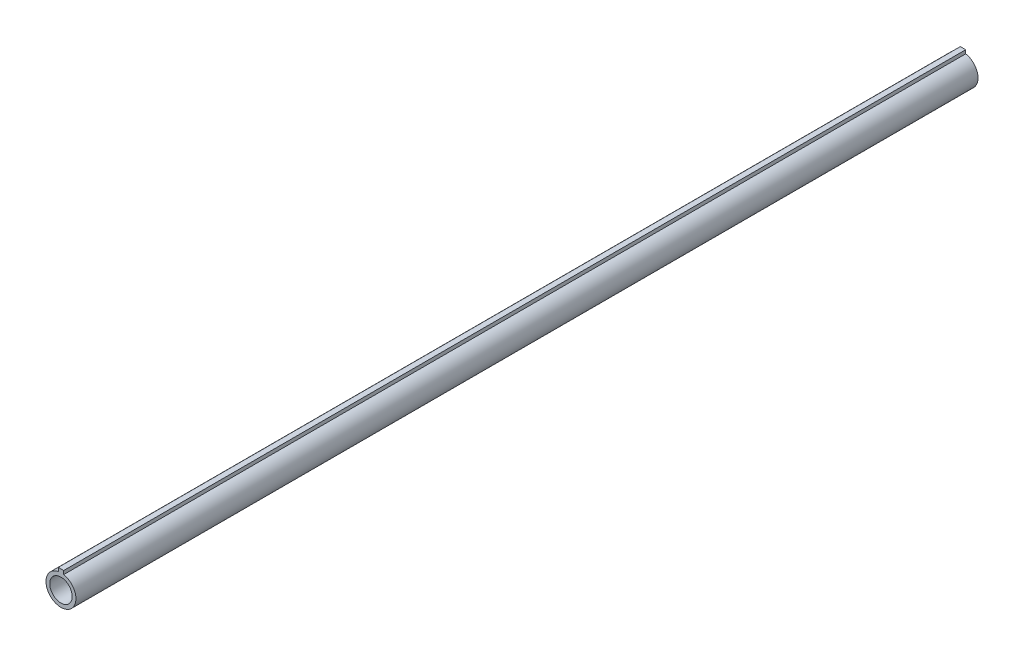
ISO-10303-21;
HEADER;
FILE_DESCRIPTION(('STEP AP214'),'2;1');
FILE_NAME('part.step','',(''),(''),'','','');
FILE_SCHEMA(('AUTOMOTIVE_DESIGN { 1 0 10303 214 1 1 1 1 }'));
ENDSEC;
DATA;
#1=APPLICATION_CONTEXT('core data for automotive mechanical design processes');
#2=APPLICATION_PROTOCOL_DEFINITION('international standard','automotive_design',2000,#1);
#3=PRODUCT_CONTEXT('',#1,'mechanical');
#4=PRODUCT('Part','Part','',(#3));
#5=PRODUCT_RELATED_PRODUCT_CATEGORY('part','',(#4));
#6=PRODUCT_DEFINITION_FORMATION('','',#4);
#7=PRODUCT_DEFINITION_CONTEXT('part definition',#1,'design');
#8=PRODUCT_DEFINITION('design','',#6,#7);
#9=PRODUCT_DEFINITION_SHAPE('','',#8);
#10=(LENGTH_UNIT() NAMED_UNIT(*) SI_UNIT(.MILLI.,.METRE.));
#11=(NAMED_UNIT(*) PLANE_ANGLE_UNIT() SI_UNIT($,.RADIAN.));
#12=(NAMED_UNIT(*) SI_UNIT($,.STERADIAN.) SOLID_ANGLE_UNIT());
#13=UNCERTAINTY_MEASURE_WITH_UNIT(LENGTH_MEASURE(1.E-05),#10,'distance_accuracy_value','');
#14=(GEOMETRIC_REPRESENTATION_CONTEXT(3) GLOBAL_UNCERTAINTY_ASSIGNED_CONTEXT((#13)) GLOBAL_UNIT_ASSIGNED_CONTEXT((#10,
#11,#12)) REPRESENTATION_CONTEXT('',''));
#15=CARTESIAN_POINT('',(0.,0.,0.));
#16=DIRECTION('',(0.,0.,1.));
#17=DIRECTION('',(1.,0.,0.));
#18=AXIS2_PLACEMENT_3D('',#15,#16,#17);
#19=CARTESIAN_POINT('',(-77.6275987335774,118.839525931107,150.6));
#20=DIRECTION('',(0.,0.,-1.));
#21=DIRECTION('',(-1.,0.,0.));
#22=AXIS2_PLACEMENT_3D('',#19,#20,#21);
#23=CYLINDRICAL_SURFACE('',#22,2.49999999999999);
#24=CARTESIAN_POINT('',(-77.6275987335774,118.839525931107,0.));
#25=DIRECTION('',(0.,0.,1.));
#26=DIRECTION('',(1.,0.,0.));
#27=AXIS2_PLACEMENT_3D('',#24,#25,#26);
#28=CIRCLE('',#27,2.49999999999999);
#29=CARTESIAN_POINT('',(-78.0775987335774,121.298692456579,0.));
#30=VERTEX_POINT('',#29);
#31=CARTESIAN_POINT('',(-77.1775987335774,121.298692456579,0.));
#32=VERTEX_POINT('',#31);
#33=EDGE_CURVE('E104',#30,#32,#28,.T.);
#34=ORIENTED_EDGE('',*,*,#33,.T.);
#35=DIRECTION('',(0.,0.,-1.));
#36=VECTOR('',#35,1.);
#37=CARTESIAN_POINT('',(-77.1775987335774,121.298692456579,150.6));
#38=LINE('',#37,#36);
#39=CARTESIAN_POINT('',(-77.1775987335774,121.298692456579,150.6));
#40=VERTEX_POINT('',#39);
#41=EDGE_CURVE('E11',#40,#32,#38,.T.);
#42=ORIENTED_EDGE('',*,*,#41,.F.);
#43=CARTESIAN_POINT('',(-77.6275987335774,118.839525931107,150.6));
#44=DIRECTION('',(0.,0.,1.));
#45=DIRECTION('',(1.,0.,0.));
#46=AXIS2_PLACEMENT_3D('',#43,#44,#45);
#47=CIRCLE('',#46,2.49999999999999);
#48=CARTESIAN_POINT('',(-78.0775987335774,121.298692456579,150.6));
#49=VERTEX_POINT('',#48);
#50=EDGE_CURVE('E92',#49,#40,#47,.T.);
#51=ORIENTED_EDGE('',*,*,#50,.F.);
#52=DIRECTION('',(0.,0.,-1.));
#53=VECTOR('',#52,1.);
#54=CARTESIAN_POINT('',(-78.0775987335774,121.298692456579,150.6));
#55=LINE('',#54,#53);
#56=EDGE_CURVE('E100',#49,#30,#55,.T.);
#57=ORIENTED_EDGE('',*,*,#56,.T.);
#58=EDGE_LOOP('',(#34,#42,#51,#57));
#59=FACE_BOUND('',#58,.T.);
#60=ADVANCED_FACE('F41',(#59),#23,.T.);
#61=CARTESIAN_POINT('',(-77.1775987335774,121.298692456579,150.6));
#62=DIRECTION('',(-1.,0.,0.));
#63=DIRECTION('',(0.,0.,1.));
#64=AXIS2_PLACEMENT_3D('',#61,#62,#63);
#65=PLANE('',#64);
#66=DIRECTION('',(0.,1.,0.));
#67=VECTOR('',#66,1.);
#68=CARTESIAN_POINT('',(-77.1775987335774,121.298692456579,0.));
#69=LINE('',#68,#67);
#70=CARTESIAN_POINT('',(-77.1775987335774,121.898692456579,0.));
#71=VERTEX_POINT('',#70);
#72=EDGE_CURVE('E96',#32,#71,#69,.T.);
#73=ORIENTED_EDGE('',*,*,#72,.T.);
#74=DIRECTION('',(0.,0.,-1.));
#75=VECTOR('',#74,1.);
#76=CARTESIAN_POINT('',(-77.1775987335774,121.898692456579,150.6));
#77=LINE('',#76,#75);
#78=CARTESIAN_POINT('',(-77.1775987335774,121.898692456579,150.6));
#79=VERTEX_POINT('',#78);
#80=EDGE_CURVE('E49',#79,#71,#77,.T.);
#81=ORIENTED_EDGE('',*,*,#80,.F.);
#82=DIRECTION('',(0.,1.,0.));
#83=VECTOR('',#82,1.);
#84=CARTESIAN_POINT('',(-77.1775987335774,121.298692456579,150.6));
#85=LINE('',#84,#83);
#86=EDGE_CURVE('E87',#40,#79,#85,.T.);
#87=ORIENTED_EDGE('',*,*,#86,.F.);
#88=ORIENTED_EDGE('',*,*,#41,.T.);
#89=EDGE_LOOP('',(#73,#81,#87,#88));
#90=FACE_BOUND('',#89,.T.);
#91=ADVANCED_FACE('F95',(#90),#65,.F.);
#92=CARTESIAN_POINT('',(-78.0775987335774,121.898692456579,150.6));
#93=DIRECTION('',(0.,-1.,0.));
#94=DIRECTION('',(0.,0.,-1.));
#95=AXIS2_PLACEMENT_3D('',#92,#93,#94);
#96=PLANE('',#95);
#97=DIRECTION('',(-1.,0.,0.));
#98=VECTOR('',#97,1.);
#99=CARTESIAN_POINT('',(-78.0775987335774,121.898692456579,0.));
#100=LINE('',#99,#98);
#101=CARTESIAN_POINT('',(-78.0775987335774,121.898692456579,0.));
#102=VERTEX_POINT('',#101);
#103=EDGE_CURVE('E74',#71,#102,#100,.T.);
#104=ORIENTED_EDGE('',*,*,#103,.T.);
#105=DIRECTION('',(0.,0.,-1.));
#106=VECTOR('',#105,1.);
#107=CARTESIAN_POINT('',(-78.0775987335774,121.898692456579,150.6));
#108=LINE('',#107,#106);
#109=CARTESIAN_POINT('',(-78.0775987335774,121.898692456579,150.6));
#110=VERTEX_POINT('',#109);
#111=EDGE_CURVE('E97',#110,#102,#108,.T.);
#112=ORIENTED_EDGE('',*,*,#111,.F.);
#113=DIRECTION('',(-1.,0.,0.));
#114=VECTOR('',#113,1.);
#115=CARTESIAN_POINT('',(-78.0775987335774,121.898692456579,150.6));
#116=LINE('',#115,#114);
#117=EDGE_CURVE('E90',#79,#110,#116,.T.);
#118=ORIENTED_EDGE('',*,*,#117,.F.);
#119=ORIENTED_EDGE('',*,*,#80,.T.);
#120=EDGE_LOOP('',(#104,#112,#118,#119));
#121=FACE_BOUND('',#120,.T.);
#122=ADVANCED_FACE('F98',(#121),#96,.F.);
#123=CARTESIAN_POINT('',(-78.0775987335774,121.298692456579,150.6));
#124=DIRECTION('',(1.,0.,0.));
#125=DIRECTION('',(0.,0.,-1.));
#126=AXIS2_PLACEMENT_3D('',#123,#124,#125);
#127=PLANE('',#126);
#128=DIRECTION('',(0.,-1.,0.));
#129=VECTOR('',#128,1.);
#130=CARTESIAN_POINT('',(-78.0775987335774,121.298692456579,0.));
#131=LINE('',#130,#129);
#132=EDGE_CURVE('E80',#102,#30,#131,.T.);
#133=ORIENTED_EDGE('',*,*,#132,.T.);
#134=ORIENTED_EDGE('',*,*,#56,.F.);
#135=DIRECTION('',(0.,-1.,0.));
#136=VECTOR('',#135,1.);
#137=CARTESIAN_POINT('',(-78.0775987335774,121.298692456579,150.6));
#138=LINE('',#137,#136);
#139=EDGE_CURVE('E57',#110,#49,#138,.T.);
#140=ORIENTED_EDGE('',*,*,#139,.F.);
#141=ORIENTED_EDGE('',*,*,#111,.T.);
#142=EDGE_LOOP('',(#133,#134,#140,#141));
#143=FACE_BOUND('',#142,.T.);
#144=ADVANCED_FACE('F112',(#143),#127,.F.);
#145=CARTESIAN_POINT('',(-77.6275987335774,118.839525931107,150.6));
#146=DIRECTION('',(0.,0.,1.));
#147=DIRECTION('',(1.,0.,0.));
#148=AXIS2_PLACEMENT_3D('',#145,#146,#147);
#149=PLANE('',#148);
#150=CARTESIAN_POINT('',(-77.6275987335774,118.839525931107,150.6));
#151=DIRECTION('',(0.,0.,1.));
#152=DIRECTION('',(1.,0.,0.));
#153=AXIS2_PLACEMENT_3D('',#150,#151,#152);
#154=CIRCLE('',#153,1.875);
#155=CARTESIAN_POINT('',(-75.7525987335774,118.839525931107,150.6));
#156=VERTEX_POINT('',#155);
#157=EDGE_CURVE('E118',#156,#156,#154,.T.);
#158=ORIENTED_EDGE('',*,*,#157,.F.);
#159=EDGE_LOOP('',(#158));
#160=FACE_BOUND('',#159,.T.);
#161=ORIENTED_EDGE('',*,*,#50,.T.);
#162=ORIENTED_EDGE('',*,*,#86,.T.);
#163=ORIENTED_EDGE('',*,*,#117,.T.);
#164=ORIENTED_EDGE('',*,*,#139,.T.);
#165=EDGE_LOOP('',(#161,#162,#163,#164));
#166=FACE_BOUND('',#165,.T.);
#167=ADVANCED_FACE('F88',(#160,#166),#149,.T.);
#168=CARTESIAN_POINT('',(-77.6275987335774,118.839525931107,0.));
#169=DIRECTION('',(0.,0.,1.));
#170=DIRECTION('',(1.,0.,0.));
#171=AXIS2_PLACEMENT_3D('',#168,#169,#170);
#172=PLANE('',#171);
#173=CARTESIAN_POINT('',(-77.6275987335774,118.839525931107,0.));
#174=DIRECTION('',(0.,0.,-1.));
#175=DIRECTION('',(-1.,0.,0.));
#176=AXIS2_PLACEMENT_3D('',#173,#174,#175);
#177=CIRCLE('',#176,1.875);
#178=CARTESIAN_POINT('',(-79.5025987335774,118.839525931107,0.));
#179=VERTEX_POINT('',#178);
#180=EDGE_CURVE('E124',#179,#179,#177,.T.);
#181=ORIENTED_EDGE('',*,*,#180,.F.);
#182=EDGE_LOOP('',(#181));
#183=FACE_BOUND('',#182,.T.);
#184=ORIENTED_EDGE('',*,*,#33,.F.);
#185=ORIENTED_EDGE('',*,*,#132,.F.);
#186=ORIENTED_EDGE('',*,*,#103,.F.);
#187=ORIENTED_EDGE('',*,*,#72,.F.);
#188=EDGE_LOOP('',(#184,#185,#186,#187));
#189=FACE_BOUND('',#188,.T.);
#190=ADVANCED_FACE('F115',(#183,#189),#172,.F.);
#191=CARTESIAN_POINT('',(-77.6275987335774,118.839525931107,78.6));
#192=DIRECTION('',(0.,0.,1.));
#193=DIRECTION('',(1.,0.,0.));
#194=AXIS2_PLACEMENT_3D('',#191,#192,#193);
#195=CYLINDRICAL_SURFACE('',#194,1.875);
#196=CARTESIAN_POINT('',(-77.6275987335774,118.839525931107,78.6));
#197=DIRECTION('',(0.,0.,1.));
#198=DIRECTION('',(1.,0.,0.));
#199=AXIS2_PLACEMENT_3D('',#196,#197,#198);
#200=CIRCLE('',#199,1.875);
#201=CARTESIAN_POINT('',(-75.7525987335774,118.839525931107,78.6));
#202=VERTEX_POINT('',#201);
#203=EDGE_CURVE('E107',#202,#202,#200,.T.);
#204=ORIENTED_EDGE('',*,*,#203,.F.);
#205=EDGE_LOOP('',(#204));
#206=FACE_BOUND('',#205,.T.);
#207=ORIENTED_EDGE('',*,*,#157,.T.);
#208=EDGE_LOOP('',(#207));
#209=FACE_BOUND('',#208,.T.);
#210=ADVANCED_FACE('F140',(#206,#209),#195,.F.);
#211=CARTESIAN_POINT('',(-77.6275987335774,118.839525931107,78.6));
#212=DIRECTION('',(0.,0.,1.));
#213=DIRECTION('',(1.,0.,0.));
#214=AXIS2_PLACEMENT_3D('',#211,#212,#213);
#215=PLANE('',#214);
#216=ORIENTED_EDGE('',*,*,#203,.T.);
#217=EDGE_LOOP('',(#216));
#218=FACE_BOUND('',#217,.T.);
#219=ADVANCED_FACE('F135',(#218),#215,.T.);
#220=CARTESIAN_POINT('',(-77.6275987335774,118.839525931107,72.));
#221=DIRECTION('',(0.,0.,-1.));
#222=DIRECTION('',(-1.,0.,0.));
#223=AXIS2_PLACEMENT_3D('',#220,#221,#222);
#224=CYLINDRICAL_SURFACE('',#223,1.875);
#225=CARTESIAN_POINT('',(-77.6275987335774,118.839525931107,72.));
#226=DIRECTION('',(0.,0.,-1.));
#227=DIRECTION('',(-1.,0.,0.));
#228=AXIS2_PLACEMENT_3D('',#225,#226,#227);
#229=CIRCLE('',#228,1.875);
#230=CARTESIAN_POINT('',(-79.5025987335774,118.839525931107,72.));
#231=VERTEX_POINT('',#230);
#232=EDGE_CURVE('E121',#231,#231,#229,.T.);
#233=ORIENTED_EDGE('',*,*,#232,.F.);
#234=EDGE_LOOP('',(#233));
#235=FACE_BOUND('',#234,.T.);
#236=ORIENTED_EDGE('',*,*,#180,.T.);
#237=EDGE_LOOP('',(#236));
#238=FACE_BOUND('',#237,.T.);
#239=ADVANCED_FACE('F132',(#235,#238),#224,.F.);
#240=CARTESIAN_POINT('',(-77.6275987335774,118.839525931107,72.));
#241=DIRECTION('',(0.,0.,-1.));
#242=DIRECTION('',(-1.,0.,0.));
#243=AXIS2_PLACEMENT_3D('',#240,#241,#242);
#244=PLANE('',#243);
#245=ORIENTED_EDGE('',*,*,#232,.T.);
#246=EDGE_LOOP('',(#245));
#247=FACE_BOUND('',#246,.T.);
#248=ADVANCED_FACE('F130',(#247),#244,.T.);
#249=CLOSED_SHELL('',(#60,#91,#122,#144,#167,#190,#210,#219,#239,#248));
#250=MANIFOLD_SOLID_BREP('B2',#249);
#251=ADVANCED_BREP_SHAPE_REPRESENTATION('',(#18,#250),#14);
#252=SHAPE_DEFINITION_REPRESENTATION(#9,#251);
ENDSEC;
END-ISO-10303-21;
